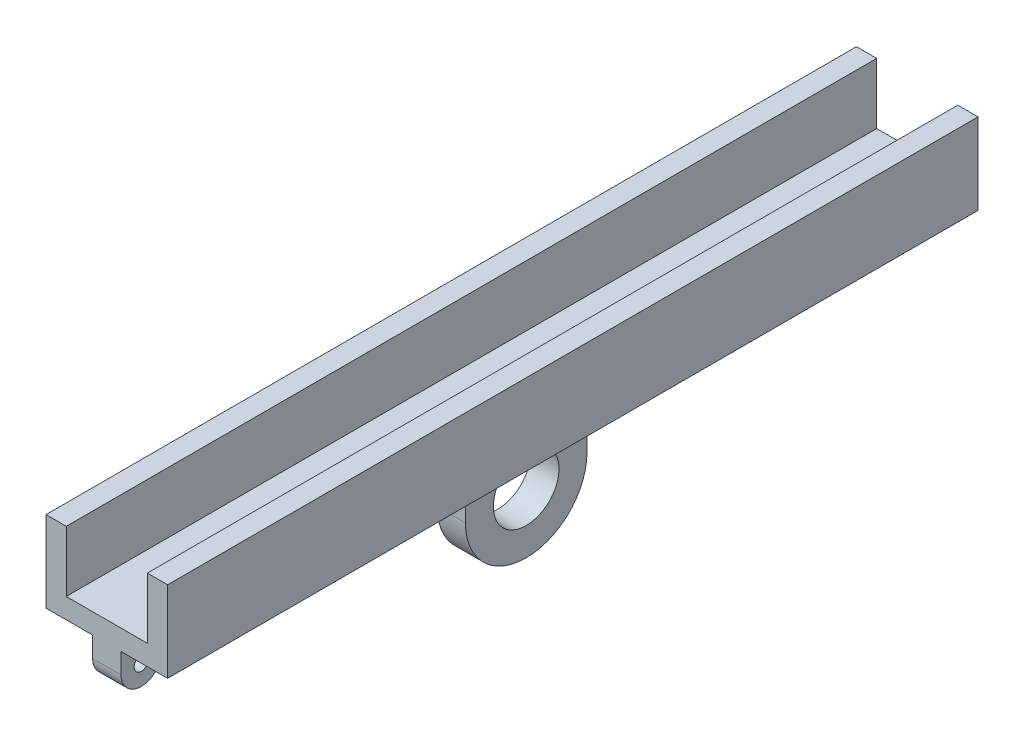
ISO-10303-21;
HEADER;
FILE_DESCRIPTION(('STEP AP214'),'2;1');
FILE_NAME('part.step','',(''),(''),'','','');
FILE_SCHEMA(('AUTOMOTIVE_DESIGN { 1 0 10303 214 1 1 1 1 }'));
ENDSEC;
DATA;
#1=APPLICATION_CONTEXT('core data for automotive mechanical design processes');
#2=APPLICATION_PROTOCOL_DEFINITION('international standard','automotive_design',2000,#1);
#3=PRODUCT_CONTEXT('',#1,'mechanical');
#4=PRODUCT('Part','Part','',(#3));
#5=PRODUCT_RELATED_PRODUCT_CATEGORY('part','',(#4));
#6=PRODUCT_DEFINITION_FORMATION('','',#4);
#7=PRODUCT_DEFINITION_CONTEXT('part definition',#1,'design');
#8=PRODUCT_DEFINITION('design','',#6,#7);
#9=PRODUCT_DEFINITION_SHAPE('','',#8);
#10=(LENGTH_UNIT() NAMED_UNIT(*) SI_UNIT(.MILLI.,.METRE.));
#11=(NAMED_UNIT(*) PLANE_ANGLE_UNIT() SI_UNIT($,.RADIAN.));
#12=(NAMED_UNIT(*) SI_UNIT($,.STERADIAN.) SOLID_ANGLE_UNIT());
#13=UNCERTAINTY_MEASURE_WITH_UNIT(LENGTH_MEASURE(1.E-05),#10,'distance_accuracy_value','');
#14=(GEOMETRIC_REPRESENTATION_CONTEXT(3) GLOBAL_UNCERTAINTY_ASSIGNED_CONTEXT((#13)) GLOBAL_UNIT_ASSIGNED_CONTEXT((#10,
#11,#12)) REPRESENTATION_CONTEXT('',''));
#15=CARTESIAN_POINT('',(0.,0.,0.));
#16=DIRECTION('',(0.,0.,1.));
#17=DIRECTION('',(1.,0.,0.));
#18=AXIS2_PLACEMENT_3D('',#15,#16,#17);
#19=CARTESIAN_POINT('',(0.,0.,200.));
#20=DIRECTION('',(1.,0.,0.));
#21=DIRECTION('',(0.,0.,-1.));
#22=AXIS2_PLACEMENT_3D('',#19,#20,#21);
#23=PLANE('',#22);
#24=DIRECTION('',(0.,-1.,0.));
#25=VECTOR('',#24,1.);
#26=CARTESIAN_POINT('',(0.,0.,0.));
#27=LINE('',#26,#25);
#28=CARTESIAN_POINT('',(0.,20.,0.));
#29=VERTEX_POINT('',#28);
#30=CARTESIAN_POINT('',(0.,0.,0.));
#31=VERTEX_POINT('',#30);
#32=EDGE_CURVE('E280',#29,#31,#27,.T.);
#33=ORIENTED_EDGE('',*,*,#32,.T.);
#34=DIRECTION('',(0.,0.,-1.));
#35=VECTOR('',#34,1.);
#36=CARTESIAN_POINT('',(0.,0.,200.));
#37=LINE('',#36,#35);
#38=CARTESIAN_POINT('',(0.,0.,200.));
#39=VERTEX_POINT('',#38);
#40=EDGE_CURVE('E374',#39,#31,#37,.T.);
#41=ORIENTED_EDGE('',*,*,#40,.F.);
#42=DIRECTION('',(0.,-1.,0.));
#43=VECTOR('',#42,1.);
#44=CARTESIAN_POINT('',(0.,0.,200.));
#45=LINE('',#44,#43);
#46=CARTESIAN_POINT('',(0.,20.,200.));
#47=VERTEX_POINT('',#46);
#48=EDGE_CURVE('E296',#47,#39,#45,.T.);
#49=ORIENTED_EDGE('',*,*,#48,.F.);
#50=DIRECTION('',(0.,0.,-1.));
#51=VECTOR('',#50,1.);
#52=CARTESIAN_POINT('',(0.,20.,200.));
#53=LINE('',#52,#51);
#54=EDGE_CURVE('E323',#47,#29,#53,.T.);
#55=ORIENTED_EDGE('',*,*,#54,.T.);
#56=EDGE_LOOP('',(#33,#41,#49,#55));
#57=FACE_BOUND('',#56,.T.);
#58=ADVANCED_FACE('F45',(#57),#23,.F.);
#59=CARTESIAN_POINT('',(0.,0.,200.));
#60=DIRECTION('',(0.,1.,0.));
#61=DIRECTION('',(0.,0.,1.));
#62=AXIS2_PLACEMENT_3D('',#59,#60,#61);
#63=PLANE('',#62);
#64=CARTESIAN_POINT('',(15.,0.,180.));
#65=DIRECTION('',(0.,1.,0.));
#66=DIRECTION('',(0.,0.,1.));
#67=AXIS2_PLACEMENT_3D('',#64,#65,#66);
#68=CIRCLE('',#67,1.5);
#69=CARTESIAN_POINT('',(15.,0.,181.5));
#70=VERTEX_POINT('',#69);
#71=EDGE_CURVE('E433',#70,#70,#68,.T.);
#72=ORIENTED_EDGE('',*,*,#71,.T.);
#73=EDGE_LOOP('',(#72));
#74=FACE_BOUND('',#73,.T.);
#75=CARTESIAN_POINT('',(15.,0.,160.));
#76=DIRECTION('',(0.,1.,0.));
#77=DIRECTION('',(0.,0.,1.));
#78=AXIS2_PLACEMENT_3D('',#75,#76,#77);
#79=CIRCLE('',#78,1.5);
#80=CARTESIAN_POINT('',(15.,0.,161.5));
#81=VERTEX_POINT('',#80);
#82=EDGE_CURVE('E452',#81,#81,#79,.T.);
#83=ORIENTED_EDGE('',*,*,#82,.T.);
#84=EDGE_LOOP('',(#83));
#85=FACE_BOUND('',#84,.T.);
#86=CARTESIAN_POINT('',(15.,0.,40.));
#87=DIRECTION('',(0.,1.,0.));
#88=DIRECTION('',(0.,0.,1.));
#89=AXIS2_PLACEMENT_3D('',#86,#87,#88);
#90=CIRCLE('',#89,1.5);
#91=CARTESIAN_POINT('',(15.,0.,41.5));
#92=VERTEX_POINT('',#91);
#93=EDGE_CURVE('E456',#92,#92,#90,.T.);
#94=ORIENTED_EDGE('',*,*,#93,.T.);
#95=EDGE_LOOP('',(#94));
#96=FACE_BOUND('',#95,.T.);
#97=CARTESIAN_POINT('',(15.,0.,20.));
#98=DIRECTION('',(0.,1.,0.));
#99=DIRECTION('',(0.,0.,1.));
#100=AXIS2_PLACEMENT_3D('',#97,#98,#99);
#101=CIRCLE('',#100,1.5);
#102=CARTESIAN_POINT('',(15.,0.,21.5));
#103=VERTEX_POINT('',#102);
#104=EDGE_CURVE('E460',#103,#103,#101,.T.);
#105=ORIENTED_EDGE('',*,*,#104,.T.);
#106=EDGE_LOOP('',(#105));
#107=FACE_BOUND('',#106,.T.);
#108=DIRECTION('',(1.,0.,0.));
#109=VECTOR('',#108,1.);
#110=CARTESIAN_POINT('',(11.5,0.,74.9999999999999));
#111=LINE('',#110,#109);
#112=CARTESIAN_POINT('',(11.5,0.,75.));
#113=VERTEX_POINT('',#112);
#114=CARTESIAN_POINT('',(18.5,0.,74.9999999999999));
#115=VERTEX_POINT('',#114);
#116=EDGE_CURVE('E254',#113,#115,#111,.T.);
#117=ORIENTED_EDGE('',*,*,#116,.F.);
#118=DIRECTION('',(0.,0.,1.));
#119=VECTOR('',#118,1.);
#120=CARTESIAN_POINT('',(11.5,0.,125.));
#121=LINE('',#120,#119);
#122=CARTESIAN_POINT('',(11.5,0.,125.));
#123=VERTEX_POINT('',#122);
#124=EDGE_CURVE('E234',#113,#123,#121,.T.);
#125=ORIENTED_EDGE('',*,*,#124,.T.);
#126=DIRECTION('',(1.,0.,0.));
#127=VECTOR('',#126,1.);
#128=CARTESIAN_POINT('',(11.5,0.,125.));
#129=LINE('',#128,#127);
#130=CARTESIAN_POINT('',(18.5,0.,125.));
#131=VERTEX_POINT('',#130);
#132=EDGE_CURVE('E290',#123,#131,#129,.T.);
#133=ORIENTED_EDGE('',*,*,#132,.T.);
#134=DIRECTION('',(0.,0.,1.));
#135=VECTOR('',#134,1.);
#136=CARTESIAN_POINT('',(18.5,0.,125.));
#137=LINE('',#136,#135);
#138=EDGE_CURVE('E258',#115,#131,#137,.T.);
#139=ORIENTED_EDGE('',*,*,#138,.F.);
#140=EDGE_LOOP('',(#117,#125,#133,#139));
#141=FACE_BOUND('',#140,.T.);
#142=DIRECTION('',(1.,0.,0.));
#143=VECTOR('',#142,1.);
#144=CARTESIAN_POINT('',(0.,0.,200.));
#145=LINE('',#144,#143);
#146=CARTESIAN_POINT('',(18.5,0.,200.));
#147=VERTEX_POINT('',#146);
#148=CARTESIAN_POINT('',(30.,0.,200.));
#149=VERTEX_POINT('',#148);
#150=EDGE_CURVE('E208',#147,#149,#145,.T.);
#151=ORIENTED_EDGE('',*,*,#150,.F.);
#152=DIRECTION('',(0.,0.,1.));
#153=VECTOR('',#152,1.);
#154=CARTESIAN_POINT('',(18.5,0.,200.));
#155=LINE('',#154,#153);
#156=CARTESIAN_POINT('',(18.5,0.,190.));
#157=VERTEX_POINT('',#156);
#158=EDGE_CURVE('E186',#157,#147,#155,.T.);
#159=ORIENTED_EDGE('',*,*,#158,.F.);
#160=DIRECTION('',(-1.,0.,0.));
#161=VECTOR('',#160,1.);
#162=CARTESIAN_POINT('',(18.5,0.,190.));
#163=LINE('',#162,#161);
#164=CARTESIAN_POINT('',(11.5,0.,190.));
#165=VERTEX_POINT('',#164);
#166=EDGE_CURVE('E196',#157,#165,#163,.T.);
#167=ORIENTED_EDGE('',*,*,#166,.T.);
#168=DIRECTION('',(0.,0.,1.));
#169=VECTOR('',#168,1.);
#170=CARTESIAN_POINT('',(11.5,0.,200.));
#171=LINE('',#170,#169);
#172=CARTESIAN_POINT('',(11.5,0.,200.));
#173=VERTEX_POINT('',#172);
#174=EDGE_CURVE('E219',#165,#173,#171,.T.);
#175=ORIENTED_EDGE('',*,*,#174,.T.);
#176=EDGE_CURVE('E301',#39,#173,#145,.T.);
#177=ORIENTED_EDGE('',*,*,#176,.F.);
#178=ORIENTED_EDGE('',*,*,#40,.T.);
#179=DIRECTION('',(1.,0.,0.));
#180=VECTOR('',#179,1.);
#181=CARTESIAN_POINT('',(0.,0.,0.));
#182=LINE('',#181,#180);
#183=CARTESIAN_POINT('',(30.,0.,0.));
#184=VERTEX_POINT('',#183);
#185=EDGE_CURVE('E327',#31,#184,#182,.T.);
#186=ORIENTED_EDGE('',*,*,#185,.T.);
#187=DIRECTION('',(0.,0.,-1.));
#188=VECTOR('',#187,1.);
#189=CARTESIAN_POINT('',(30.,0.,200.));
#190=LINE('',#189,#188);
#191=EDGE_CURVE('E370',#149,#184,#190,.T.);
#192=ORIENTED_EDGE('',*,*,#191,.F.);
#193=EDGE_LOOP('',(#151,#159,#167,#175,#177,#178,#186,#192));
#194=FACE_BOUND('',#193,.T.);
#195=ADVANCED_FACE('F206',(#74,#85,#96,#107,#141,#194),#63,.F.);
#196=CARTESIAN_POINT('',(30.,0.,200.));
#197=DIRECTION('',(-1.,0.,0.));
#198=DIRECTION('',(0.,-1.,0.));
#199=AXIS2_PLACEMENT_3D('',#196,#197,#198);
#200=PLANE('',#199);
#201=DIRECTION('',(0.,1.,0.));
#202=VECTOR('',#201,1.);
#203=CARTESIAN_POINT('',(30.,0.,0.));
#204=LINE('',#203,#202);
#205=CARTESIAN_POINT('',(30.,20.,0.));
#206=VERTEX_POINT('',#205);
#207=EDGE_CURVE('E330',#184,#206,#204,.T.);
#208=ORIENTED_EDGE('',*,*,#207,.T.);
#209=DIRECTION('',(0.,0.,-1.));
#210=VECTOR('',#209,1.);
#211=CARTESIAN_POINT('',(30.,20.,200.));
#212=LINE('',#211,#210);
#213=CARTESIAN_POINT('',(30.,20.,200.));
#214=VERTEX_POINT('',#213);
#215=EDGE_CURVE('E366',#214,#206,#212,.T.);
#216=ORIENTED_EDGE('',*,*,#215,.F.);
#217=DIRECTION('',(0.,1.,0.));
#218=VECTOR('',#217,1.);
#219=CARTESIAN_POINT('',(30.,0.,200.));
#220=LINE('',#219,#218);
#221=EDGE_CURVE('E305',#149,#214,#220,.T.);
#222=ORIENTED_EDGE('',*,*,#221,.F.);
#223=ORIENTED_EDGE('',*,*,#191,.T.);
#224=EDGE_LOOP('',(#208,#216,#222,#223));
#225=FACE_BOUND('',#224,.T.);
#226=ADVANCED_FACE('F396',(#225),#200,.F.);
#227=CARTESIAN_POINT('',(25.,20.,200.));
#228=DIRECTION('',(0.,-1.,0.));
#229=DIRECTION('',(0.,0.,-1.));
#230=AXIS2_PLACEMENT_3D('',#227,#228,#229);
#231=PLANE('',#230);
#232=DIRECTION('',(-1.,0.,0.));
#233=VECTOR('',#232,1.);
#234=CARTESIAN_POINT('',(25.,20.,0.));
#235=LINE('',#234,#233);
#236=CARTESIAN_POINT('',(25.,20.,0.));
#237=VERTEX_POINT('',#236);
#238=EDGE_CURVE('E333',#206,#237,#235,.T.);
#239=ORIENTED_EDGE('',*,*,#238,.T.);
#240=DIRECTION('',(0.,0.,-1.));
#241=VECTOR('',#240,1.);
#242=CARTESIAN_POINT('',(25.,20.,200.));
#243=LINE('',#242,#241);
#244=CARTESIAN_POINT('',(25.,20.,200.));
#245=VERTEX_POINT('',#244);
#246=EDGE_CURVE('E362',#245,#237,#243,.T.);
#247=ORIENTED_EDGE('',*,*,#246,.F.);
#248=DIRECTION('',(-1.,0.,0.));
#249=VECTOR('',#248,1.);
#250=CARTESIAN_POINT('',(25.,20.,200.));
#251=LINE('',#250,#249);
#252=EDGE_CURVE('E308',#214,#245,#251,.T.);
#253=ORIENTED_EDGE('',*,*,#252,.F.);
#254=ORIENTED_EDGE('',*,*,#215,.T.);
#255=EDGE_LOOP('',(#239,#247,#253,#254));
#256=FACE_BOUND('',#255,.T.);
#257=ADVANCED_FACE('F401',(#256),#231,.F.);
#258=CARTESIAN_POINT('',(25.,20.,200.));
#259=DIRECTION('',(1.,0.,0.));
#260=DIRECTION('',(0.,1.,0.));
#261=AXIS2_PLACEMENT_3D('',#258,#259,#260);
#262=PLANE('',#261);
#263=DIRECTION('',(0.,-1.,0.));
#264=VECTOR('',#263,1.);
#265=CARTESIAN_POINT('',(25.,20.,0.));
#266=LINE('',#265,#264);
#267=CARTESIAN_POINT('',(25.,5.,0.));
#268=VERTEX_POINT('',#267);
#269=EDGE_CURVE('E336',#237,#268,#266,.T.);
#270=ORIENTED_EDGE('',*,*,#269,.T.);
#271=DIRECTION('',(0.,0.,-1.));
#272=VECTOR('',#271,1.);
#273=CARTESIAN_POINT('',(25.,5.,200.));
#274=LINE('',#273,#272);
#275=CARTESIAN_POINT('',(25.,5.,200.));
#276=VERTEX_POINT('',#275);
#277=EDGE_CURVE('E358',#276,#268,#274,.T.);
#278=ORIENTED_EDGE('',*,*,#277,.F.);
#279=DIRECTION('',(0.,-1.,0.));
#280=VECTOR('',#279,1.);
#281=CARTESIAN_POINT('',(25.,20.,200.));
#282=LINE('',#281,#280);
#283=EDGE_CURVE('E311',#245,#276,#282,.T.);
#284=ORIENTED_EDGE('',*,*,#283,.F.);
#285=ORIENTED_EDGE('',*,*,#246,.T.);
#286=EDGE_LOOP('',(#270,#278,#284,#285));
#287=FACE_BOUND('',#286,.T.);
#288=ADVANCED_FACE('F407',(#287),#262,.F.);
#289=CARTESIAN_POINT('',(5.,5.,200.));
#290=DIRECTION('',(0.,-1.,0.));
#291=DIRECTION('',(0.,0.,-1.));
#292=AXIS2_PLACEMENT_3D('',#289,#290,#291);
#293=PLANE('',#292);
#294=CARTESIAN_POINT('',(15.,5.,180.));
#295=DIRECTION('',(0.,1.,0.));
#296=DIRECTION('',(0.,0.,1.));
#297=AXIS2_PLACEMENT_3D('',#294,#295,#296);
#298=CIRCLE('',#297,1.5);
#299=CARTESIAN_POINT('',(15.,5.,181.5));
#300=VERTEX_POINT('',#299);
#301=EDGE_CURVE('E464',#300,#300,#298,.T.);
#302=ORIENTED_EDGE('',*,*,#301,.F.);
#303=EDGE_LOOP('',(#302));
#304=FACE_BOUND('',#303,.T.);
#305=CARTESIAN_POINT('',(15.,5.,160.));
#306=DIRECTION('',(0.,1.,0.));
#307=DIRECTION('',(0.,0.,1.));
#308=AXIS2_PLACEMENT_3D('',#305,#306,#307);
#309=CIRCLE('',#308,1.5);
#310=CARTESIAN_POINT('',(15.,5.,161.5));
#311=VERTEX_POINT('',#310);
#312=EDGE_CURVE('E473',#311,#311,#309,.T.);
#313=ORIENTED_EDGE('',*,*,#312,.F.);
#314=EDGE_LOOP('',(#313));
#315=FACE_BOUND('',#314,.T.);
#316=CARTESIAN_POINT('',(15.,5.,40.));
#317=DIRECTION('',(0.,1.,0.));
#318=DIRECTION('',(0.,0.,-1.));
#319=AXIS2_PLACEMENT_3D('',#316,#317,#318);
#320=CIRCLE('',#319,1.5);
#321=CARTESIAN_POINT('',(15.,5.,38.5));
#322=VERTEX_POINT('',#321);
#323=EDGE_CURVE('E469',#322,#322,#320,.T.);
#324=ORIENTED_EDGE('',*,*,#323,.F.);
#325=EDGE_LOOP('',(#324));
#326=FACE_BOUND('',#325,.T.);
#327=CARTESIAN_POINT('',(15.,5.,20.));
#328=DIRECTION('',(0.,1.,0.));
#329=DIRECTION('',(0.,0.,-1.));
#330=AXIS2_PLACEMENT_3D('',#327,#328,#329);
#331=CIRCLE('',#330,1.5);
#332=CARTESIAN_POINT('',(15.,5.,18.5));
#333=VERTEX_POINT('',#332);
#334=EDGE_CURVE('E465',#333,#333,#331,.T.);
#335=ORIENTED_EDGE('',*,*,#334,.F.);
#336=EDGE_LOOP('',(#335));
#337=FACE_BOUND('',#336,.T.);
#338=DIRECTION('',(-1.,0.,0.));
#339=VECTOR('',#338,1.);
#340=CARTESIAN_POINT('',(5.,5.,0.));
#341=LINE('',#340,#339);
#342=CARTESIAN_POINT('',(5.,5.,0.));
#343=VERTEX_POINT('',#342);
#344=EDGE_CURVE('E339',#268,#343,#341,.T.);
#345=ORIENTED_EDGE('',*,*,#344,.T.);
#346=DIRECTION('',(0.,0.,-1.));
#347=VECTOR('',#346,1.);
#348=CARTESIAN_POINT('',(5.,5.,200.));
#349=LINE('',#348,#347);
#350=CARTESIAN_POINT('',(5.,5.,200.));
#351=VERTEX_POINT('',#350);
#352=EDGE_CURVE('E354',#351,#343,#349,.T.);
#353=ORIENTED_EDGE('',*,*,#352,.F.);
#354=DIRECTION('',(-1.,0.,0.));
#355=VECTOR('',#354,1.);
#356=CARTESIAN_POINT('',(5.,5.,200.));
#357=LINE('',#356,#355);
#358=EDGE_CURVE('E314',#276,#351,#357,.T.);
#359=ORIENTED_EDGE('',*,*,#358,.F.);
#360=ORIENTED_EDGE('',*,*,#277,.T.);
#361=EDGE_LOOP('',(#345,#353,#359,#360));
#362=FACE_BOUND('',#361,.T.);
#363=ADVANCED_FACE('F411',(#304,#315,#326,#337,#362),#293,.F.);
#364=CARTESIAN_POINT('',(5.,20.,200.));
#365=DIRECTION('',(-1.,0.,0.));
#366=DIRECTION('',(0.,-1.,0.));
#367=AXIS2_PLACEMENT_3D('',#364,#365,#366);
#368=PLANE('',#367);
#369=DIRECTION('',(0.,1.,0.));
#370=VECTOR('',#369,1.);
#371=CARTESIAN_POINT('',(5.,20.,0.));
#372=LINE('',#371,#370);
#373=CARTESIAN_POINT('',(5.,20.,0.));
#374=VERTEX_POINT('',#373);
#375=EDGE_CURVE('E342',#343,#374,#372,.T.);
#376=ORIENTED_EDGE('',*,*,#375,.T.);
#377=DIRECTION('',(0.,0.,-1.));
#378=VECTOR('',#377,1.);
#379=CARTESIAN_POINT('',(5.,20.,200.));
#380=LINE('',#379,#378);
#381=CARTESIAN_POINT('',(5.,20.,200.));
#382=VERTEX_POINT('',#381);
#383=EDGE_CURVE('E350',#382,#374,#380,.T.);
#384=ORIENTED_EDGE('',*,*,#383,.F.);
#385=DIRECTION('',(0.,1.,0.));
#386=VECTOR('',#385,1.);
#387=CARTESIAN_POINT('',(5.,20.,200.));
#388=LINE('',#387,#386);
#389=EDGE_CURVE('E317',#351,#382,#388,.T.);
#390=ORIENTED_EDGE('',*,*,#389,.F.);
#391=ORIENTED_EDGE('',*,*,#352,.T.);
#392=EDGE_LOOP('',(#376,#384,#390,#391));
#393=FACE_BOUND('',#392,.T.);
#394=ADVANCED_FACE('F416',(#393),#368,.F.);
#395=CARTESIAN_POINT('',(0.,20.,200.));
#396=DIRECTION('',(0.,-1.,0.));
#397=DIRECTION('',(0.,0.,-1.));
#398=AXIS2_PLACEMENT_3D('',#395,#396,#397);
#399=PLANE('',#398);
#400=DIRECTION('',(-1.,0.,0.));
#401=VECTOR('',#400,1.);
#402=CARTESIAN_POINT('',(0.,20.,0.));
#403=LINE('',#402,#401);
#404=EDGE_CURVE('E300',#374,#29,#403,.T.);
#405=ORIENTED_EDGE('',*,*,#404,.T.);
#406=ORIENTED_EDGE('',*,*,#54,.F.);
#407=DIRECTION('',(-1.,0.,0.));
#408=VECTOR('',#407,1.);
#409=CARTESIAN_POINT('',(0.,20.,200.));
#410=LINE('',#409,#408);
#411=EDGE_CURVE('E320',#382,#47,#410,.T.);
#412=ORIENTED_EDGE('',*,*,#411,.F.);
#413=ORIENTED_EDGE('',*,*,#383,.T.);
#414=EDGE_LOOP('',(#405,#406,#412,#413));
#415=FACE_BOUND('',#414,.T.);
#416=ADVANCED_FACE('F422',(#415),#399,.F.);
#417=CARTESIAN_POINT('',(0.,0.,200.));
#418=DIRECTION('',(0.,0.,-1.));
#419=DIRECTION('',(-1.,0.,0.));
#420=AXIS2_PLACEMENT_3D('',#417,#418,#419);
#421=PLANE('',#420);
#422=DIRECTION('',(0.,-1.,0.));
#423=VECTOR('',#422,1.);
#424=CARTESIAN_POINT('',(11.5,0.,200.));
#425=LINE('',#424,#423);
#426=CARTESIAN_POINT('',(11.5,-5.,200.));
#427=VERTEX_POINT('',#426);
#428=EDGE_CURVE('E213',#173,#427,#425,.T.);
#429=ORIENTED_EDGE('',*,*,#428,.T.);
#430=DIRECTION('',(-1.,0.,0.));
#431=VECTOR('',#430,1.);
#432=CARTESIAN_POINT('',(0.,-4.99999999999999,200.));
#433=LINE('',#432,#431);
#434=CARTESIAN_POINT('',(18.5,-5.,200.));
#435=VERTEX_POINT('',#434);
#436=EDGE_CURVE('E11',#427,#435,#433,.F.);
#437=ORIENTED_EDGE('',*,*,#436,.T.);
#438=DIRECTION('',(0.,-1.,0.));
#439=VECTOR('',#438,1.);
#440=CARTESIAN_POINT('',(18.5,0.,200.));
#441=LINE('',#440,#439);
#442=EDGE_CURVE('E193',#147,#435,#441,.T.);
#443=ORIENTED_EDGE('',*,*,#442,.F.);
#444=ORIENTED_EDGE('',*,*,#150,.T.);
#445=ORIENTED_EDGE('',*,*,#221,.T.);
#446=ORIENTED_EDGE('',*,*,#252,.T.);
#447=ORIENTED_EDGE('',*,*,#283,.T.);
#448=ORIENTED_EDGE('',*,*,#358,.T.);
#449=ORIENTED_EDGE('',*,*,#389,.T.);
#450=ORIENTED_EDGE('',*,*,#411,.T.);
#451=ORIENTED_EDGE('',*,*,#48,.T.);
#452=ORIENTED_EDGE('',*,*,#176,.T.);
#453=EDGE_LOOP('',(#429,#437,#443,#444,#445,#446,#447,#448,#449,#450,#451,#452));
#454=FACE_BOUND('',#453,.T.);
#455=ADVANCED_FACE('F391',(#454),#421,.F.);
#456=CARTESIAN_POINT('',(0.,0.,0.));
#457=DIRECTION('',(0.,0.,-1.));
#458=DIRECTION('',(-1.,0.,0.));
#459=AXIS2_PLACEMENT_3D('',#456,#457,#458);
#460=PLANE('',#459);
#461=ORIENTED_EDGE('',*,*,#32,.F.);
#462=ORIENTED_EDGE('',*,*,#404,.F.);
#463=ORIENTED_EDGE('',*,*,#375,.F.);
#464=ORIENTED_EDGE('',*,*,#344,.F.);
#465=ORIENTED_EDGE('',*,*,#269,.F.);
#466=ORIENTED_EDGE('',*,*,#238,.F.);
#467=ORIENTED_EDGE('',*,*,#207,.F.);
#468=ORIENTED_EDGE('',*,*,#185,.F.);
#469=EDGE_LOOP('',(#461,#462,#463,#464,#465,#466,#467,#468));
#470=FACE_BOUND('',#469,.T.);
#471=ADVANCED_FACE('F587',(#470),#460,.T.);
#472=CARTESIAN_POINT('',(11.5,-10.,75.));
#473=DIRECTION('',(1.,0.,0.));
#474=DIRECTION('',(0.,1.,0.));
#475=AXIS2_PLACEMENT_3D('',#472,#473,#474);
#476=CYLINDRICAL_SURFACE('',#475,9.99999999999999);
#477=CARTESIAN_POINT('',(18.5,-10.,75.));
#478=DIRECTION('',(-1.,0.,0.));
#479=DIRECTION('',(0.,-1.,0.));
#480=AXIS2_PLACEMENT_3D('',#477,#478,#479);
#481=CIRCLE('',#480,9.99999999999999);
#482=CARTESIAN_POINT('',(18.5,-10.,85.));
#483=VERTEX_POINT('',#482);
#484=EDGE_CURVE('E226',#483,#115,#481,.T.);
#485=ORIENTED_EDGE('',*,*,#484,.F.);
#486=DIRECTION('',(1.,0.,0.));
#487=VECTOR('',#486,1.);
#488=CARTESIAN_POINT('',(11.5,-10.,85.));
#489=LINE('',#488,#487);
#490=CARTESIAN_POINT('',(11.5,-10.,85.));
#491=VERTEX_POINT('',#490);
#492=EDGE_CURVE('E277',#491,#483,#489,.T.);
#493=ORIENTED_EDGE('',*,*,#492,.F.);
#494=CARTESIAN_POINT('',(11.5,-10.,75.));
#495=DIRECTION('',(-1.,0.,0.));
#496=DIRECTION('',(0.,-1.,0.));
#497=AXIS2_PLACEMENT_3D('',#494,#495,#496);
#498=CIRCLE('',#497,9.99999999999999);
#499=EDGE_CURVE('E230',#491,#113,#498,.T.);
#500=ORIENTED_EDGE('',*,*,#499,.T.);
#501=ORIENTED_EDGE('',*,*,#116,.T.);
#502=EDGE_LOOP('',(#485,#493,#500,#501));
#503=FACE_BOUND('',#502,.T.);
#504=ADVANCED_FACE('F514',(#503),#476,.F.);
#505=CARTESIAN_POINT('',(11.5,-15.,85.));
#506=DIRECTION('',(0.,0.,-1.));
#507=DIRECTION('',(0.,1.,0.));
#508=AXIS2_PLACEMENT_3D('',#505,#506,#507);
#509=PLANE('',#508);
#510=DIRECTION('',(0.,1.,0.));
#511=VECTOR('',#510,1.);
#512=CARTESIAN_POINT('',(18.5,-15.,85.));
#513=LINE('',#512,#511);
#514=CARTESIAN_POINT('',(18.5,-15.,85.));
#515=VERTEX_POINT('',#514);
#516=EDGE_CURVE('E235',#515,#483,#513,.T.);
#517=ORIENTED_EDGE('',*,*,#516,.F.);
#518=DIRECTION('',(1.,0.,0.));
#519=VECTOR('',#518,1.);
#520=CARTESIAN_POINT('',(11.5,-15.,85.));
#521=LINE('',#520,#519);
#522=CARTESIAN_POINT('',(11.5,-15.,85.));
#523=VERTEX_POINT('',#522);
#524=EDGE_CURVE('E281',#523,#515,#521,.T.);
#525=ORIENTED_EDGE('',*,*,#524,.F.);
#526=DIRECTION('',(0.,1.,0.));
#527=VECTOR('',#526,1.);
#528=CARTESIAN_POINT('',(11.5,-15.,85.));
#529=LINE('',#528,#527);
#530=EDGE_CURVE('E250',#523,#491,#529,.T.);
#531=ORIENTED_EDGE('',*,*,#530,.T.);
#532=ORIENTED_EDGE('',*,*,#492,.T.);
#533=EDGE_LOOP('',(#517,#525,#531,#532));
#534=FACE_BOUND('',#533,.T.);
#535=ADVANCED_FACE('F517',(#534),#509,.T.);
#536=CARTESIAN_POINT('',(11.5,-15.,100.));
#537=DIRECTION('',(1.,0.,0.));
#538=DIRECTION('',(0.,1.,0.));
#539=AXIS2_PLACEMENT_3D('',#536,#537,#538);
#540=CYLINDRICAL_SURFACE('',#539,15.);
#541=CARTESIAN_POINT('',(18.5,-15.,100.));
#542=DIRECTION('',(1.,0.,0.));
#543=DIRECTION('',(0.,1.,0.));
#544=AXIS2_PLACEMENT_3D('',#541,#542,#543);
#545=CIRCLE('',#544,15.);
#546=CARTESIAN_POINT('',(18.5,-15.,115.));
#547=VERTEX_POINT('',#546);
#548=EDGE_CURVE('E270',#547,#515,#545,.T.);
#549=ORIENTED_EDGE('',*,*,#548,.F.);
#550=DIRECTION('',(1.,0.,0.));
#551=VECTOR('',#550,1.);
#552=CARTESIAN_POINT('',(11.5,-15.,115.));
#553=LINE('',#552,#551);
#554=CARTESIAN_POINT('',(11.5,-15.,115.));
#555=VERTEX_POINT('',#554);
#556=EDGE_CURVE('E284',#555,#547,#553,.T.);
#557=ORIENTED_EDGE('',*,*,#556,.F.);
#558=CARTESIAN_POINT('',(11.5,-15.,100.));
#559=DIRECTION('',(1.,0.,0.));
#560=DIRECTION('',(0.,1.,0.));
#561=AXIS2_PLACEMENT_3D('',#558,#559,#560);
#562=CIRCLE('',#561,15.);
#563=EDGE_CURVE('E246',#555,#523,#562,.T.);
#564=ORIENTED_EDGE('',*,*,#563,.T.);
#565=ORIENTED_EDGE('',*,*,#524,.T.);
#566=EDGE_LOOP('',(#549,#557,#564,#565));
#567=FACE_BOUND('',#566,.T.);
#568=ADVANCED_FACE('F529',(#567),#540,.T.);
#569=CARTESIAN_POINT('',(11.5,-15.,115.));
#570=DIRECTION('',(0.,0.,1.));
#571=DIRECTION('',(0.,-1.,0.));
#572=AXIS2_PLACEMENT_3D('',#569,#570,#571);
#573=PLANE('',#572);
#574=DIRECTION('',(0.,-1.,0.));
#575=VECTOR('',#574,1.);
#576=CARTESIAN_POINT('',(18.5,-15.,115.));
#577=LINE('',#576,#575);
#578=CARTESIAN_POINT('',(18.5,-10.,115.));
#579=VERTEX_POINT('',#578);
#580=EDGE_CURVE('E266',#579,#547,#577,.T.);
#581=ORIENTED_EDGE('',*,*,#580,.F.);
#582=DIRECTION('',(1.,0.,0.));
#583=VECTOR('',#582,1.);
#584=CARTESIAN_POINT('',(11.5,-10.,115.));
#585=LINE('',#584,#583);
#586=CARTESIAN_POINT('',(11.5,-10.,115.));
#587=VERTEX_POINT('',#586);
#588=EDGE_CURVE('E287',#587,#579,#585,.T.);
#589=ORIENTED_EDGE('',*,*,#588,.F.);
#590=DIRECTION('',(0.,-1.,0.));
#591=VECTOR('',#590,1.);
#592=CARTESIAN_POINT('',(11.5,-15.,115.));
#593=LINE('',#592,#591);
#594=EDGE_CURVE('E242',#587,#555,#593,.T.);
#595=ORIENTED_EDGE('',*,*,#594,.T.);
#596=ORIENTED_EDGE('',*,*,#556,.T.);
#597=EDGE_LOOP('',(#581,#589,#595,#596));
#598=FACE_BOUND('',#597,.T.);
#599=ADVANCED_FACE('F522',(#598),#573,.T.);
#600=CARTESIAN_POINT('',(11.5,-10.,125.));
#601=DIRECTION('',(1.,0.,0.));
#602=DIRECTION('',(0.,1.,0.));
#603=AXIS2_PLACEMENT_3D('',#600,#601,#602);
#604=CYLINDRICAL_SURFACE('',#603,10.);
#605=CARTESIAN_POINT('',(18.5,-10.,125.));
#606=DIRECTION('',(-1.,0.,0.));
#607=DIRECTION('',(0.,1.,0.));
#608=AXIS2_PLACEMENT_3D('',#605,#606,#607);
#609=CIRCLE('',#608,10.);
#610=EDGE_CURVE('E262',#131,#579,#609,.T.);
#611=ORIENTED_EDGE('',*,*,#610,.F.);
#612=ORIENTED_EDGE('',*,*,#132,.F.);
#613=CARTESIAN_POINT('',(11.5,-10.,125.));
#614=DIRECTION('',(-1.,0.,0.));
#615=DIRECTION('',(0.,1.,0.));
#616=AXIS2_PLACEMENT_3D('',#613,#614,#615);
#617=CIRCLE('',#616,10.);
#618=EDGE_CURVE('E238',#123,#587,#617,.T.);
#619=ORIENTED_EDGE('',*,*,#618,.T.);
#620=ORIENTED_EDGE('',*,*,#588,.T.);
#621=EDGE_LOOP('',(#611,#612,#619,#620));
#622=FACE_BOUND('',#621,.T.);
#623=ADVANCED_FACE('F526',(#622),#604,.F.);
#624=CARTESIAN_POINT('',(11.5,-10.,75.));
#625=DIRECTION('',(-1.,0.,0.));
#626=DIRECTION('',(0.,-1.,0.));
#627=AXIS2_PLACEMENT_3D('',#624,#625,#626);
#628=PLANE('',#627);
#629=CARTESIAN_POINT('',(11.5,-15.,100.));
#630=DIRECTION('',(1.,0.,0.));
#631=DIRECTION('',(0.,1.,0.));
#632=AXIS2_PLACEMENT_3D('',#629,#630,#631);
#633=CIRCLE('',#632,8.09999999999999);
#634=CARTESIAN_POINT('',(11.5,-6.9,100.));
#635=VERTEX_POINT('',#634);
#636=EDGE_CURVE('E222',#635,#635,#633,.T.);
#637=ORIENTED_EDGE('',*,*,#636,.T.);
#638=EDGE_LOOP('',(#637));
#639=FACE_BOUND('',#638,.T.);
#640=ORIENTED_EDGE('',*,*,#499,.F.);
#641=ORIENTED_EDGE('',*,*,#530,.F.);
#642=ORIENTED_EDGE('',*,*,#563,.F.);
#643=ORIENTED_EDGE('',*,*,#594,.F.);
#644=ORIENTED_EDGE('',*,*,#618,.F.);
#645=ORIENTED_EDGE('',*,*,#124,.F.);
#646=EDGE_LOOP('',(#640,#641,#642,#643,#644,#645));
#647=FACE_BOUND('',#646,.T.);
#648=ADVANCED_FACE('F511',(#639,#647),#628,.T.);
#649=CARTESIAN_POINT('',(18.5,-10.,75.));
#650=DIRECTION('',(-1.,0.,0.));
#651=DIRECTION('',(0.,-1.,0.));
#652=AXIS2_PLACEMENT_3D('',#649,#650,#651);
#653=PLANE('',#652);
#654=CARTESIAN_POINT('',(18.5,-15.,100.));
#655=DIRECTION('',(1.,0.,0.));
#656=DIRECTION('',(0.,1.,0.));
#657=AXIS2_PLACEMENT_3D('',#654,#655,#656);
#658=CIRCLE('',#657,8.09999999999999);
#659=CARTESIAN_POINT('',(18.5,-6.9,100.));
#660=VERTEX_POINT('',#659);
#661=EDGE_CURVE('E204',#660,#660,#658,.T.);
#662=ORIENTED_EDGE('',*,*,#661,.F.);
#663=EDGE_LOOP('',(#662));
#664=FACE_BOUND('',#663,.T.);
#665=ORIENTED_EDGE('',*,*,#484,.T.);
#666=ORIENTED_EDGE('',*,*,#138,.T.);
#667=ORIENTED_EDGE('',*,*,#610,.T.);
#668=ORIENTED_EDGE('',*,*,#580,.T.);
#669=ORIENTED_EDGE('',*,*,#548,.T.);
#670=ORIENTED_EDGE('',*,*,#516,.T.);
#671=EDGE_LOOP('',(#665,#666,#667,#668,#669,#670));
#672=FACE_BOUND('',#671,.T.);
#673=ADVANCED_FACE('F528',(#664,#672),#653,.F.);
#674=CARTESIAN_POINT('',(11.5,-15.,100.));
#675=DIRECTION('',(1.,0.,0.));
#676=DIRECTION('',(0.,1.,0.));
#677=AXIS2_PLACEMENT_3D('',#674,#675,#676);
#678=CYLINDRICAL_SURFACE('',#677,8.09999999999999);
#679=ORIENTED_EDGE('',*,*,#636,.F.);
#680=EDGE_LOOP('',(#679));
#681=FACE_BOUND('',#680,.T.);
#682=ORIENTED_EDGE('',*,*,#661,.T.);
#683=EDGE_LOOP('',(#682));
#684=FACE_BOUND('',#683,.T.);
#685=ADVANCED_FACE('F561',(#681,#684),#678,.F.);
#686=CARTESIAN_POINT('',(18.5,0.,0.));
#687=DIRECTION('',(1.,0.,0.));
#688=DIRECTION('',(0.,0.,-1.));
#689=AXIS2_PLACEMENT_3D('',#686,#687,#688);
#690=PLANE('',#689);
#691=CARTESIAN_POINT('',(18.5,-5.,195.));
#692=DIRECTION('',(1.,0.,0.));
#693=DIRECTION('',(0.,0.,-1.));
#694=AXIS2_PLACEMENT_3D('',#691,#692,#693);
#695=CIRCLE('',#694,5.);
#696=CARTESIAN_POINT('',(18.5,-10.,195.));
#697=VERTEX_POINT('',#696);
#698=EDGE_CURVE('E62',#435,#697,#695,.T.);
#699=ORIENTED_EDGE('',*,*,#698,.T.);
#700=CARTESIAN_POINT('',(18.5,-5.,195.));
#701=DIRECTION('',(1.,0.,0.));
#702=DIRECTION('',(0.,0.,-1.));
#703=AXIS2_PLACEMENT_3D('',#700,#701,#702);
#704=CIRCLE('',#703,5.);
#705=CARTESIAN_POINT('',(18.5,-5.,190.));
#706=VERTEX_POINT('',#705);
#707=EDGE_CURVE('E55',#697,#706,#704,.T.);
#708=ORIENTED_EDGE('',*,*,#707,.T.);
#709=DIRECTION('',(0.,1.,0.));
#710=VECTOR('',#709,1.);
#711=CARTESIAN_POINT('',(18.5,0.,190.));
#712=LINE('',#711,#710);
#713=EDGE_CURVE('E181',#706,#157,#712,.T.);
#714=ORIENTED_EDGE('',*,*,#713,.T.);
#715=ORIENTED_EDGE('',*,*,#158,.T.);
#716=ORIENTED_EDGE('',*,*,#442,.T.);
#717=EDGE_LOOP('',(#699,#708,#714,#715,#716));
#718=FACE_BOUND('',#717,.T.);
#719=CARTESIAN_POINT('',(18.5,-5.,195.));
#720=DIRECTION('',(1.,0.,0.));
#721=DIRECTION('',(0.,1.,0.));
#722=AXIS2_PLACEMENT_3D('',#719,#720,#721);
#723=CIRCLE('',#722,1.75000000000001);
#724=CARTESIAN_POINT('',(18.5,-3.24999999999999,195.));
#725=VERTEX_POINT('',#724);
#726=EDGE_CURVE('E216',#725,#725,#723,.T.);
#727=ORIENTED_EDGE('',*,*,#726,.F.);
#728=EDGE_LOOP('',(#727));
#729=FACE_BOUND('',#728,.T.);
#730=ADVANCED_FACE('F183',(#718,#729),#690,.T.);
#731=CARTESIAN_POINT('',(11.5,0.,0.));
#732=DIRECTION('',(1.,0.,0.));
#733=DIRECTION('',(0.,0.,-1.));
#734=AXIS2_PLACEMENT_3D('',#731,#732,#733);
#735=PLANE('',#734);
#736=DIRECTION('',(0.,1.,0.));
#737=VECTOR('',#736,1.);
#738=CARTESIAN_POINT('',(11.5,0.,190.));
#739=LINE('',#738,#737);
#740=CARTESIAN_POINT('',(11.5,-5.,190.));
#741=VERTEX_POINT('',#740);
#742=EDGE_CURVE('E199',#741,#165,#739,.T.);
#743=ORIENTED_EDGE('',*,*,#742,.F.);
#744=CARTESIAN_POINT('',(11.5,-5.,195.));
#745=DIRECTION('',(1.,0.,0.));
#746=DIRECTION('',(0.,0.,-1.));
#747=AXIS2_PLACEMENT_3D('',#744,#745,#746);
#748=CIRCLE('',#747,5.);
#749=CARTESIAN_POINT('',(11.5,-10.,195.));
#750=VERTEX_POINT('',#749);
#751=EDGE_CURVE('E384',#741,#750,#748,.F.);
#752=ORIENTED_EDGE('',*,*,#751,.T.);
#753=CARTESIAN_POINT('',(11.5,-5.,195.));
#754=DIRECTION('',(1.,0.,0.));
#755=DIRECTION('',(0.,0.,-1.));
#756=AXIS2_PLACEMENT_3D('',#753,#754,#755);
#757=CIRCLE('',#756,5.);
#758=EDGE_CURVE('E381',#750,#427,#757,.F.);
#759=ORIENTED_EDGE('',*,*,#758,.T.);
#760=ORIENTED_EDGE('',*,*,#428,.F.);
#761=ORIENTED_EDGE('',*,*,#174,.F.);
#762=EDGE_LOOP('',(#743,#752,#759,#760,#761));
#763=FACE_BOUND('',#762,.T.);
#764=CARTESIAN_POINT('',(11.5,-5.,195.));
#765=DIRECTION('',(1.,0.,0.));
#766=DIRECTION('',(0.,1.,0.));
#767=AXIS2_PLACEMENT_3D('',#764,#765,#766);
#768=CIRCLE('',#767,1.75000000000001);
#769=CARTESIAN_POINT('',(11.5,-3.24999999999999,195.));
#770=VERTEX_POINT('',#769);
#771=EDGE_CURVE('E432',#770,#770,#768,.T.);
#772=ORIENTED_EDGE('',*,*,#771,.T.);
#773=EDGE_LOOP('',(#772));
#774=FACE_BOUND('',#773,.T.);
#775=ADVANCED_FACE('F435',(#763,#774),#735,.F.);
#776=CARTESIAN_POINT('',(18.5,0.,190.));
#777=DIRECTION('',(0.,0.,1.));
#778=DIRECTION('',(1.,0.,0.));
#779=AXIS2_PLACEMENT_3D('',#776,#777,#778);
#780=PLANE('',#779);
#781=ORIENTED_EDGE('',*,*,#713,.F.);
#782=DIRECTION('',(-1.,0.,0.));
#783=VECTOR('',#782,1.);
#784=CARTESIAN_POINT('',(18.5,-5.,190.));
#785=LINE('',#784,#783);
#786=EDGE_CURVE('E378',#706,#741,#785,.T.);
#787=ORIENTED_EDGE('',*,*,#786,.T.);
#788=ORIENTED_EDGE('',*,*,#742,.T.);
#789=ORIENTED_EDGE('',*,*,#166,.F.);
#790=EDGE_LOOP('',(#781,#787,#788,#789));
#791=FACE_BOUND('',#790,.T.);
#792=ADVANCED_FACE('F197',(#791),#780,.F.);
#793=CARTESIAN_POINT('',(18.5,-5.,195.));
#794=DIRECTION('',(-1.,0.,0.));
#795=DIRECTION('',(0.,-1.,0.));
#796=AXIS2_PLACEMENT_3D('',#793,#794,#795);
#797=CYLINDRICAL_SURFACE('',#796,1.75000000000001);
#798=ORIENTED_EDGE('',*,*,#726,.T.);
#799=EDGE_LOOP('',(#798));
#800=FACE_BOUND('',#799,.T.);
#801=ORIENTED_EDGE('',*,*,#771,.F.);
#802=EDGE_LOOP('',(#801));
#803=FACE_BOUND('',#802,.T.);
#804=ADVANCED_FACE('F548',(#800,#803),#797,.F.);
#805=CARTESIAN_POINT('',(18.5,-5.,195.));
#806=DIRECTION('',(-1.,0.,0.));
#807=DIRECTION('',(0.,-1.,0.));
#808=AXIS2_PLACEMENT_3D('',#805,#806,#807);
#809=CYLINDRICAL_SURFACE('',#808,5.);
#810=DIRECTION('',(-1.,0.,0.));
#811=VECTOR('',#810,1.);
#812=CARTESIAN_POINT('',(18.5,-10.,195.));
#813=LINE('',#812,#811);
#814=EDGE_CURVE('E49',#697,#750,#813,.T.);
#815=ORIENTED_EDGE('',*,*,#814,.F.);
#816=ORIENTED_EDGE('',*,*,#698,.F.);
#817=ORIENTED_EDGE('',*,*,#436,.F.);
#818=ORIENTED_EDGE('',*,*,#758,.F.);
#819=EDGE_LOOP('',(#815,#816,#817,#818));
#820=FACE_BOUND('',#819,.T.);
#821=ADVANCED_FACE('F47',(#820),#809,.T.);
#822=CARTESIAN_POINT('',(18.5,-5.,195.));
#823=DIRECTION('',(-1.,0.,0.));
#824=DIRECTION('',(0.,-1.,0.));
#825=AXIS2_PLACEMENT_3D('',#822,#823,#824);
#826=CYLINDRICAL_SURFACE('',#825,5.);
#827=ORIENTED_EDGE('',*,*,#707,.F.);
#828=ORIENTED_EDGE('',*,*,#814,.T.);
#829=ORIENTED_EDGE('',*,*,#751,.F.);
#830=ORIENTED_EDGE('',*,*,#786,.F.);
#831=EDGE_LOOP('',(#827,#828,#829,#830));
#832=FACE_BOUND('',#831,.T.);
#833=ADVANCED_FACE('F434',(#832),#826,.T.);
#834=CARTESIAN_POINT('',(15.,-2.,20.));
#835=DIRECTION('',(0.,1.,0.));
#836=DIRECTION('',(0.,0.,1.));
#837=AXIS2_PLACEMENT_3D('',#834,#835,#836);
#838=CYLINDRICAL_SURFACE('',#837,1.5);
#839=ORIENTED_EDGE('',*,*,#334,.T.);
#840=EDGE_LOOP('',(#839));
#841=FACE_BOUND('',#840,.T.);
#842=ORIENTED_EDGE('',*,*,#104,.F.);
#843=EDGE_LOOP('',(#842));
#844=FACE_BOUND('',#843,.T.);
#845=ADVANCED_FACE('F493',(#841,#844),#838,.F.);
#846=CARTESIAN_POINT('',(15.,-2.,40.));
#847=DIRECTION('',(0.,1.,0.));
#848=DIRECTION('',(0.,0.,1.));
#849=AXIS2_PLACEMENT_3D('',#846,#847,#848);
#850=CYLINDRICAL_SURFACE('',#849,1.5);
#851=ORIENTED_EDGE('',*,*,#323,.T.);
#852=EDGE_LOOP('',(#851));
#853=FACE_BOUND('',#852,.T.);
#854=ORIENTED_EDGE('',*,*,#93,.F.);
#855=EDGE_LOOP('',(#854));
#856=FACE_BOUND('',#855,.T.);
#857=ADVANCED_FACE('F496',(#853,#856),#850,.F.);
#858=CARTESIAN_POINT('',(15.,-2.,160.));
#859=DIRECTION('',(0.,1.,0.));
#860=DIRECTION('',(0.,0.,1.));
#861=AXIS2_PLACEMENT_3D('',#858,#859,#860);
#862=CYLINDRICAL_SURFACE('',#861,1.5);
#863=ORIENTED_EDGE('',*,*,#312,.T.);
#864=EDGE_LOOP('',(#863));
#865=FACE_BOUND('',#864,.T.);
#866=ORIENTED_EDGE('',*,*,#82,.F.);
#867=EDGE_LOOP('',(#866));
#868=FACE_BOUND('',#867,.T.);
#869=ADVANCED_FACE('F639',(#865,#868),#862,.F.);
#870=CARTESIAN_POINT('',(15.,-2.,180.));
#871=DIRECTION('',(0.,1.,0.));
#872=DIRECTION('',(0.,0.,1.));
#873=AXIS2_PLACEMENT_3D('',#870,#871,#872);
#874=CYLINDRICAL_SURFACE('',#873,1.5);
#875=ORIENTED_EDGE('',*,*,#301,.T.);
#876=EDGE_LOOP('',(#875));
#877=FACE_BOUND('',#876,.T.);
#878=ORIENTED_EDGE('',*,*,#71,.F.);
#879=EDGE_LOOP('',(#878));
#880=FACE_BOUND('',#879,.T.);
#881=ADVANCED_FACE('F481',(#877,#880),#874,.F.);
#882=CLOSED_SHELL('',(#58,#195,#226,#257,#288,#363,#394,#416,#455,#471,#504,#535,#568,#599,#623,
#648,#673,#685,#730,#775,#792,#804,#821,#833,#845,#857,#869,#881));
#883=MANIFOLD_SOLID_BREP('B2',#882);
#884=ADVANCED_BREP_SHAPE_REPRESENTATION('',(#18,#883),#14);
#885=SHAPE_DEFINITION_REPRESENTATION(#9,#884);
ENDSEC;
END-ISO-10303-21;
